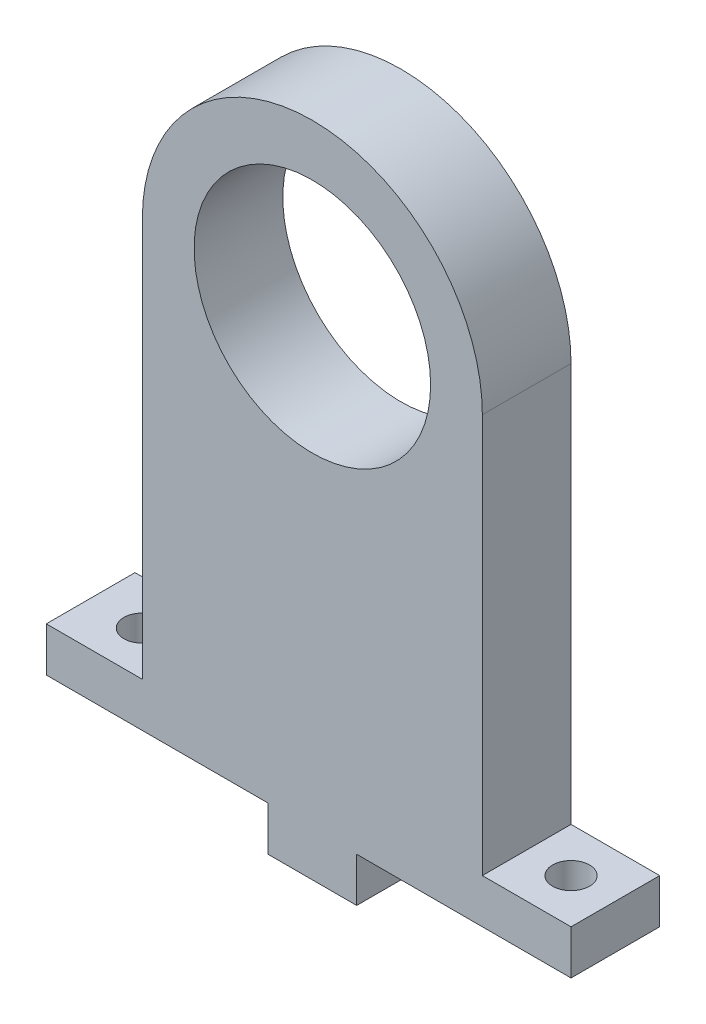
ISO-10303-21;
HEADER;
FILE_DESCRIPTION(('STEP AP214'),'2;1');
FILE_NAME('part.step','',(''),(''),'','','');
FILE_SCHEMA(('AUTOMOTIVE_DESIGN { 1 0 10303 214 1 1 1 1 }'));
ENDSEC;
DATA;
#1=APPLICATION_CONTEXT('core data for automotive mechanical design processes');
#2=APPLICATION_PROTOCOL_DEFINITION('international standard','automotive_design',2000,#1);
#3=PRODUCT_CONTEXT('',#1,'mechanical');
#4=PRODUCT('Part','Part','',(#3));
#5=PRODUCT_RELATED_PRODUCT_CATEGORY('part','',(#4));
#6=PRODUCT_DEFINITION_FORMATION('','',#4);
#7=PRODUCT_DEFINITION_CONTEXT('part definition',#1,'design');
#8=PRODUCT_DEFINITION('design','',#6,#7);
#9=PRODUCT_DEFINITION_SHAPE('','',#8);
#10=(LENGTH_UNIT() NAMED_UNIT(*) SI_UNIT(.MILLI.,.METRE.));
#11=(NAMED_UNIT(*) PLANE_ANGLE_UNIT() SI_UNIT($,.RADIAN.));
#12=(NAMED_UNIT(*) SI_UNIT($,.STERADIAN.) SOLID_ANGLE_UNIT());
#13=UNCERTAINTY_MEASURE_WITH_UNIT(LENGTH_MEASURE(1.E-05),#10,'distance_accuracy_value','');
#14=(GEOMETRIC_REPRESENTATION_CONTEXT(3) GLOBAL_UNCERTAINTY_ASSIGNED_CONTEXT((#13)) GLOBAL_UNIT_ASSIGNED_CONTEXT((#10,
#11,#12)) REPRESENTATION_CONTEXT('',''));
#15=CARTESIAN_POINT('',(0.,0.,0.));
#16=DIRECTION('',(0.,0.,1.));
#17=DIRECTION('',(1.,0.,0.));
#18=AXIS2_PLACEMENT_3D('',#15,#16,#17);
#19=CARTESIAN_POINT('',(0.,0.,6.));
#20=DIRECTION('',(0.,0.,1.));
#21=DIRECTION('',(1.,0.,0.));
#22=AXIS2_PLACEMENT_3D('',#19,#20,#21);
#23=PLANE('',#22);
#24=DIRECTION('',(1.,0.,0.));
#25=VECTOR('',#24,1.);
#26=CARTESIAN_POINT('',(0.,-33.,6.));
#27=LINE('',#26,#25);
#28=CARTESIAN_POINT('',(-2.99999999999998,-33.,6.));
#29=VERTEX_POINT('',#28);
#30=CARTESIAN_POINT('',(3.00000000000002,-33.,6.));
#31=VERTEX_POINT('',#30);
#32=EDGE_CURVE('E52',#29,#31,#27,.T.);
#33=ORIENTED_EDGE('',*,*,#32,.T.);
#34=DIRECTION('',(0.,1.,0.));
#35=VECTOR('',#34,1.);
#36=CARTESIAN_POINT('',(3.00000000000002,-33.,6.));
#37=LINE('',#36,#35);
#38=CARTESIAN_POINT('',(3.00000000000002,-30.,6.));
#39=VERTEX_POINT('',#38);
#40=EDGE_CURVE('E108',#31,#39,#37,.T.);
#41=ORIENTED_EDGE('',*,*,#40,.T.);
#42=DIRECTION('',(1.,0.,0.));
#43=VECTOR('',#42,1.);
#44=CARTESIAN_POINT('',(17.5,-30.,6.));
#45=LINE('',#44,#43);
#46=CARTESIAN_POINT('',(17.5,-30.,6.));
#47=VERTEX_POINT('',#46);
#48=EDGE_CURVE('E208',#39,#47,#45,.T.);
#49=ORIENTED_EDGE('',*,*,#48,.T.);
#50=DIRECTION('',(0.,1.,0.));
#51=VECTOR('',#50,1.);
#52=CARTESIAN_POINT('',(17.5,-27.,6.));
#53=LINE('',#52,#51);
#54=CARTESIAN_POINT('',(17.5,-27.,6.));
#55=VERTEX_POINT('',#54);
#56=EDGE_CURVE('E228',#47,#55,#53,.T.);
#57=ORIENTED_EDGE('',*,*,#56,.T.);
#58=DIRECTION('',(-1.,0.,0.));
#59=VECTOR('',#58,1.);
#60=CARTESIAN_POINT('',(11.5,-27.,6.));
#61=LINE('',#60,#59);
#62=CARTESIAN_POINT('',(11.5,-27.,6.));
#63=VERTEX_POINT('',#62);
#64=EDGE_CURVE('E225',#55,#63,#61,.T.);
#65=ORIENTED_EDGE('',*,*,#64,.T.);
#66=DIRECTION('',(0.,1.,0.));
#67=VECTOR('',#66,1.);
#68=CARTESIAN_POINT('',(11.5,0.,6.));
#69=LINE('',#68,#67);
#70=CARTESIAN_POINT('',(11.5,0.,6.));
#71=VERTEX_POINT('',#70);
#72=EDGE_CURVE('E227',#63,#71,#69,.T.);
#73=ORIENTED_EDGE('',*,*,#72,.T.);
#74=CARTESIAN_POINT('',(0.,0.,6.));
#75=DIRECTION('',(0.,0.,1.));
#76=DIRECTION('',(1.,0.,0.));
#77=AXIS2_PLACEMENT_3D('',#74,#75,#76);
#78=CIRCLE('',#77,11.5);
#79=CARTESIAN_POINT('',(-11.5,0.,6.));
#80=VERTEX_POINT('',#79);
#81=EDGE_CURVE('E230',#71,#80,#78,.T.);
#82=ORIENTED_EDGE('',*,*,#81,.T.);
#83=DIRECTION('',(0.,-1.,0.));
#84=VECTOR('',#83,1.);
#85=CARTESIAN_POINT('',(-11.5,0.,6.));
#86=LINE('',#85,#84);
#87=CARTESIAN_POINT('',(-11.5,-27.,6.));
#88=VERTEX_POINT('',#87);
#89=EDGE_CURVE('E236',#80,#88,#86,.T.);
#90=ORIENTED_EDGE('',*,*,#89,.T.);
#91=DIRECTION('',(-1.,0.,0.));
#92=VECTOR('',#91,1.);
#93=CARTESIAN_POINT('',(-11.5,-27.,6.));
#94=LINE('',#93,#92);
#95=CARTESIAN_POINT('',(-18.,-27.,6.));
#96=VERTEX_POINT('',#95);
#97=EDGE_CURVE('E140',#88,#96,#94,.T.);
#98=ORIENTED_EDGE('',*,*,#97,.T.);
#99=DIRECTION('',(0.,-1.,0.));
#100=VECTOR('',#99,1.);
#101=CARTESIAN_POINT('',(-18.,-27.,6.));
#102=LINE('',#101,#100);
#103=CARTESIAN_POINT('',(-18.,-30.,6.));
#104=VERTEX_POINT('',#103);
#105=EDGE_CURVE('E134',#96,#104,#102,.T.);
#106=ORIENTED_EDGE('',*,*,#105,.T.);
#107=DIRECTION('',(1.,0.,0.));
#108=VECTOR('',#107,1.);
#109=CARTESIAN_POINT('',(-2.99999999999998,-30.,6.));
#110=LINE('',#109,#108);
#111=CARTESIAN_POINT('',(-2.99999999999998,-30.,6.));
#112=VERTEX_POINT('',#111);
#113=EDGE_CURVE('E138',#104,#112,#110,.T.);
#114=ORIENTED_EDGE('',*,*,#113,.T.);
#115=DIRECTION('',(0.,-1.,0.));
#116=VECTOR('',#115,1.);
#117=CARTESIAN_POINT('',(-2.99999999999998,-33.,6.));
#118=LINE('',#117,#116);
#119=EDGE_CURVE('E154',#112,#29,#118,.T.);
#120=ORIENTED_EDGE('',*,*,#119,.T.);
#121=EDGE_LOOP('',(#33,#41,#49,#57,#65,#73,#82,#90,#98,#106,#114,#120));
#122=FACE_BOUND('',#121,.T.);
#123=CARTESIAN_POINT('',(0.,0.,6.));
#124=DIRECTION('',(0.,0.,1.));
#125=DIRECTION('',(1.,0.,0.));
#126=AXIS2_PLACEMENT_3D('',#123,#124,#125);
#127=CIRCLE('',#126,8.);
#128=CARTESIAN_POINT('',(8.,0.,6.));
#129=VERTEX_POINT('',#128);
#130=EDGE_CURVE('E163',#129,#129,#127,.T.);
#131=ORIENTED_EDGE('',*,*,#130,.F.);
#132=EDGE_LOOP('',(#131));
#133=FACE_BOUND('',#132,.T.);
#134=ADVANCED_FACE('F35',(#122,#133),#23,.T.);
#135=CARTESIAN_POINT('',(0.,0.,0.));
#136=DIRECTION('',(0.,0.,1.));
#137=DIRECTION('',(1.,0.,0.));
#138=AXIS2_PLACEMENT_3D('',#135,#136,#137);
#139=PLANE('',#138);
#140=DIRECTION('',(0.,1.,0.));
#141=VECTOR('',#140,1.);
#142=CARTESIAN_POINT('',(3.00000000000002,-33.,0.));
#143=LINE('',#142,#141);
#144=CARTESIAN_POINT('',(3.00000000000002,-33.,0.));
#145=VERTEX_POINT('',#144);
#146=CARTESIAN_POINT('',(3.00000000000002,-30.,0.));
#147=VERTEX_POINT('',#146);
#148=EDGE_CURVE('E160',#145,#147,#143,.T.);
#149=ORIENTED_EDGE('',*,*,#148,.F.);
#150=DIRECTION('',(1.,0.,0.));
#151=VECTOR('',#150,1.);
#152=CARTESIAN_POINT('',(0.,-33.,0.));
#153=LINE('',#152,#151);
#154=CARTESIAN_POINT('',(-2.99999999999998,-33.,0.));
#155=VERTEX_POINT('',#154);
#156=EDGE_CURVE('E180',#155,#145,#153,.T.);
#157=ORIENTED_EDGE('',*,*,#156,.F.);
#158=DIRECTION('',(0.,-1.,0.));
#159=VECTOR('',#158,1.);
#160=CARTESIAN_POINT('',(-2.99999999999998,-33.,0.));
#161=LINE('',#160,#159);
#162=CARTESIAN_POINT('',(-2.99999999999998,-30.,0.));
#163=VERTEX_POINT('',#162);
#164=EDGE_CURVE('E101',#163,#155,#161,.T.);
#165=ORIENTED_EDGE('',*,*,#164,.F.);
#166=DIRECTION('',(1.,0.,0.));
#167=VECTOR('',#166,1.);
#168=CARTESIAN_POINT('',(-2.99999999999998,-30.,0.));
#169=LINE('',#168,#167);
#170=CARTESIAN_POINT('',(-18.,-30.,0.));
#171=VERTEX_POINT('',#170);
#172=EDGE_CURVE('E94',#171,#163,#169,.T.);
#173=ORIENTED_EDGE('',*,*,#172,.F.);
#174=DIRECTION('',(0.,-1.,0.));
#175=VECTOR('',#174,1.);
#176=CARTESIAN_POINT('',(-18.,-27.,0.));
#177=LINE('',#176,#175);
#178=CARTESIAN_POINT('',(-18.,-27.,0.));
#179=VERTEX_POINT('',#178);
#180=EDGE_CURVE('E148',#179,#171,#177,.T.);
#181=ORIENTED_EDGE('',*,*,#180,.F.);
#182=DIRECTION('',(-1.,0.,0.));
#183=VECTOR('',#182,1.);
#184=CARTESIAN_POINT('',(-11.5,-27.,0.));
#185=LINE('',#184,#183);
#186=CARTESIAN_POINT('',(-11.5,-27.,0.));
#187=VERTEX_POINT('',#186);
#188=EDGE_CURVE('E175',#187,#179,#185,.T.);
#189=ORIENTED_EDGE('',*,*,#188,.F.);
#190=DIRECTION('',(0.,-1.,0.));
#191=VECTOR('',#190,1.);
#192=CARTESIAN_POINT('',(-11.5,0.,0.));
#193=LINE('',#192,#191);
#194=CARTESIAN_POINT('',(-11.5,0.,0.));
#195=VERTEX_POINT('',#194);
#196=EDGE_CURVE('E173',#195,#187,#193,.T.);
#197=ORIENTED_EDGE('',*,*,#196,.F.);
#198=CARTESIAN_POINT('',(0.,0.,0.));
#199=DIRECTION('',(0.,0.,1.));
#200=DIRECTION('',(1.,0.,0.));
#201=AXIS2_PLACEMENT_3D('',#198,#199,#200);
#202=CIRCLE('',#201,11.5);
#203=CARTESIAN_POINT('',(11.5,0.,0.));
#204=VERTEX_POINT('',#203);
#205=EDGE_CURVE('E171',#204,#195,#202,.T.);
#206=ORIENTED_EDGE('',*,*,#205,.F.);
#207=DIRECTION('',(0.,1.,0.));
#208=VECTOR('',#207,1.);
#209=CARTESIAN_POINT('',(11.5,0.,0.));
#210=LINE('',#209,#208);
#211=CARTESIAN_POINT('',(11.5,-27.,0.));
#212=VERTEX_POINT('',#211);
#213=EDGE_CURVE('E169',#212,#204,#210,.T.);
#214=ORIENTED_EDGE('',*,*,#213,.F.);
#215=DIRECTION('',(-1.,0.,0.));
#216=VECTOR('',#215,1.);
#217=CARTESIAN_POINT('',(11.5,-27.,0.));
#218=LINE('',#217,#216);
#219=CARTESIAN_POINT('',(17.5,-27.,0.));
#220=VERTEX_POINT('',#219);
#221=EDGE_CURVE('E167',#220,#212,#218,.T.);
#222=ORIENTED_EDGE('',*,*,#221,.F.);
#223=DIRECTION('',(0.,1.,0.));
#224=VECTOR('',#223,1.);
#225=CARTESIAN_POINT('',(17.5,-27.,0.));
#226=LINE('',#225,#224);
#227=CARTESIAN_POINT('',(17.5,-30.,0.));
#228=VERTEX_POINT('',#227);
#229=EDGE_CURVE('E165',#228,#220,#226,.T.);
#230=ORIENTED_EDGE('',*,*,#229,.F.);
#231=DIRECTION('',(1.,0.,0.));
#232=VECTOR('',#231,1.);
#233=CARTESIAN_POINT('',(17.5,-30.,0.));
#234=LINE('',#233,#232);
#235=EDGE_CURVE('E162',#147,#228,#234,.T.);
#236=ORIENTED_EDGE('',*,*,#235,.F.);
#237=EDGE_LOOP('',(#149,#157,#165,#173,#181,#189,#197,#206,#214,#222,#230,#236));
#238=FACE_BOUND('',#237,.T.);
#239=CARTESIAN_POINT('',(0.,0.,0.));
#240=DIRECTION('',(0.,0.,1.));
#241=DIRECTION('',(1.,0.,0.));
#242=AXIS2_PLACEMENT_3D('',#239,#240,#241);
#243=CIRCLE('',#242,8.);
#244=CARTESIAN_POINT('',(8.,0.,0.));
#245=VERTEX_POINT('',#244);
#246=EDGE_CURVE('E252',#245,#245,#243,.T.);
#247=ORIENTED_EDGE('',*,*,#246,.T.);
#248=EDGE_LOOP('',(#247));
#249=FACE_BOUND('',#248,.T.);
#250=ADVANCED_FACE('F212',(#238,#249),#139,.F.);
#251=CARTESIAN_POINT('',(3.00000000000002,-33.,6.));
#252=DIRECTION('',(-1.,0.,0.));
#253=DIRECTION('',(0.,-1.,0.));
#254=AXIS2_PLACEMENT_3D('',#251,#252,#253);
#255=PLANE('',#254);
#256=ORIENTED_EDGE('',*,*,#148,.T.);
#257=DIRECTION('',(0.,0.,-1.));
#258=VECTOR('',#257,1.);
#259=CARTESIAN_POINT('',(3.00000000000002,-30.,6.));
#260=LINE('',#259,#258);
#261=EDGE_CURVE('E44',#39,#147,#260,.T.);
#262=ORIENTED_EDGE('',*,*,#261,.F.);
#263=ORIENTED_EDGE('',*,*,#40,.F.);
#264=DIRECTION('',(0.,0.,-1.));
#265=VECTOR('',#264,1.);
#266=CARTESIAN_POINT('',(3.00000000000002,-33.,6.));
#267=LINE('',#266,#265);
#268=EDGE_CURVE('E11',#31,#145,#267,.T.);
#269=ORIENTED_EDGE('',*,*,#268,.T.);
#270=EDGE_LOOP('',(#256,#262,#263,#269));
#271=FACE_BOUND('',#270,.T.);
#272=ADVANCED_FACE('F37',(#271),#255,.F.);
#273=CARTESIAN_POINT('',(17.5,-30.,6.));
#274=DIRECTION('',(0.,1.,0.));
#275=DIRECTION('',(-1.,0.,0.));
#276=AXIS2_PLACEMENT_3D('',#273,#274,#275);
#277=PLANE('',#276);
#278=CARTESIAN_POINT('',(14.5,-30.,3.));
#279=DIRECTION('',(0.,1.,0.));
#280=DIRECTION('',(0.,0.,1.));
#281=AXIS2_PLACEMENT_3D('',#278,#279,#280);
#282=CIRCLE('',#281,1.25);
#283=CARTESIAN_POINT('',(14.5,-30.,4.25));
#284=VERTEX_POINT('',#283);
#285=EDGE_CURVE('E261',#284,#284,#282,.T.);
#286=ORIENTED_EDGE('',*,*,#285,.T.);
#287=EDGE_LOOP('',(#286));
#288=FACE_BOUND('',#287,.T.);
#289=ORIENTED_EDGE('',*,*,#235,.T.);
#290=DIRECTION('',(0.,0.,-1.));
#291=VECTOR('',#290,1.);
#292=CARTESIAN_POINT('',(17.5,-30.,6.));
#293=LINE('',#292,#291);
#294=EDGE_CURVE('E200',#47,#228,#293,.T.);
#295=ORIENTED_EDGE('',*,*,#294,.F.);
#296=ORIENTED_EDGE('',*,*,#48,.F.);
#297=ORIENTED_EDGE('',*,*,#261,.T.);
#298=EDGE_LOOP('',(#289,#295,#296,#297));
#299=FACE_BOUND('',#298,.T.);
#300=ADVANCED_FACE('F206',(#288,#299),#277,.F.);
#301=CARTESIAN_POINT('',(17.5,-27.,6.));
#302=DIRECTION('',(-1.,0.,0.));
#303=DIRECTION('',(0.,0.,1.));
#304=AXIS2_PLACEMENT_3D('',#301,#302,#303);
#305=PLANE('',#304);
#306=ORIENTED_EDGE('',*,*,#229,.T.);
#307=DIRECTION('',(0.,0.,-1.));
#308=VECTOR('',#307,1.);
#309=CARTESIAN_POINT('',(17.5,-27.,6.));
#310=LINE('',#309,#308);
#311=EDGE_CURVE('E197',#55,#220,#310,.T.);
#312=ORIENTED_EDGE('',*,*,#311,.F.);
#313=ORIENTED_EDGE('',*,*,#56,.F.);
#314=ORIENTED_EDGE('',*,*,#294,.T.);
#315=EDGE_LOOP('',(#306,#312,#313,#314));
#316=FACE_BOUND('',#315,.T.);
#317=ADVANCED_FACE('F219',(#316),#305,.F.);
#318=CARTESIAN_POINT('',(11.5,-27.,6.));
#319=DIRECTION('',(0.,-1.,0.));
#320=DIRECTION('',(0.,0.,-1.));
#321=AXIS2_PLACEMENT_3D('',#318,#319,#320);
#322=PLANE('',#321);
#323=CARTESIAN_POINT('',(14.5,-27.,3.));
#324=DIRECTION('',(0.,1.,0.));
#325=DIRECTION('',(0.,0.,1.));
#326=AXIS2_PLACEMENT_3D('',#323,#324,#325);
#327=CIRCLE('',#326,1.25);
#328=CARTESIAN_POINT('',(14.5,-27.,4.25));
#329=VERTEX_POINT('',#328);
#330=EDGE_CURVE('E264',#329,#329,#327,.T.);
#331=ORIENTED_EDGE('',*,*,#330,.F.);
#332=EDGE_LOOP('',(#331));
#333=FACE_BOUND('',#332,.T.);
#334=ORIENTED_EDGE('',*,*,#221,.T.);
#335=DIRECTION('',(0.,0.,-1.));
#336=VECTOR('',#335,1.);
#337=CARTESIAN_POINT('',(11.5,-27.,6.));
#338=LINE('',#337,#336);
#339=EDGE_CURVE('E194',#63,#212,#338,.T.);
#340=ORIENTED_EDGE('',*,*,#339,.F.);
#341=ORIENTED_EDGE('',*,*,#64,.F.);
#342=ORIENTED_EDGE('',*,*,#311,.T.);
#343=EDGE_LOOP('',(#334,#340,#341,#342));
#344=FACE_BOUND('',#343,.T.);
#345=ADVANCED_FACE('F223',(#333,#344),#322,.F.);
#346=CARTESIAN_POINT('',(11.5,0.,6.));
#347=DIRECTION('',(-1.,0.,0.));
#348=DIRECTION('',(0.,-1.,0.));
#349=AXIS2_PLACEMENT_3D('',#346,#347,#348);
#350=PLANE('',#349);
#351=ORIENTED_EDGE('',*,*,#213,.T.);
#352=DIRECTION('',(0.,0.,-1.));
#353=VECTOR('',#352,1.);
#354=CARTESIAN_POINT('',(11.5,0.,6.));
#355=LINE('',#354,#353);
#356=EDGE_CURVE('E191',#71,#204,#355,.T.);
#357=ORIENTED_EDGE('',*,*,#356,.F.);
#358=ORIENTED_EDGE('',*,*,#72,.F.);
#359=ORIENTED_EDGE('',*,*,#339,.T.);
#360=EDGE_LOOP('',(#351,#357,#358,#359));
#361=FACE_BOUND('',#360,.T.);
#362=ADVANCED_FACE('F279',(#361),#350,.F.);
#363=CARTESIAN_POINT('',(0.,0.,6.));
#364=DIRECTION('',(0.,0.,-1.));
#365=DIRECTION('',(-1.,0.,0.));
#366=AXIS2_PLACEMENT_3D('',#363,#364,#365);
#367=CYLINDRICAL_SURFACE('',#366,11.5);
#368=ORIENTED_EDGE('',*,*,#205,.T.);
#369=DIRECTION('',(0.,0.,-1.));
#370=VECTOR('',#369,1.);
#371=CARTESIAN_POINT('',(-11.5,0.,6.));
#372=LINE('',#371,#370);
#373=EDGE_CURVE('E188',#80,#195,#372,.T.);
#374=ORIENTED_EDGE('',*,*,#373,.F.);
#375=ORIENTED_EDGE('',*,*,#81,.F.);
#376=ORIENTED_EDGE('',*,*,#356,.T.);
#377=EDGE_LOOP('',(#368,#374,#375,#376));
#378=FACE_BOUND('',#377,.T.);
#379=ADVANCED_FACE('F285',(#378),#367,.T.);
#380=CARTESIAN_POINT('',(-11.5,0.,6.));
#381=DIRECTION('',(1.,0.,0.));
#382=DIRECTION('',(0.,1.,0.));
#383=AXIS2_PLACEMENT_3D('',#380,#381,#382);
#384=PLANE('',#383);
#385=ORIENTED_EDGE('',*,*,#196,.T.);
#386=DIRECTION('',(0.,0.,-1.));
#387=VECTOR('',#386,1.);
#388=CARTESIAN_POINT('',(-11.5,-27.,6.));
#389=LINE('',#388,#387);
#390=EDGE_CURVE('E185',#88,#187,#389,.T.);
#391=ORIENTED_EDGE('',*,*,#390,.F.);
#392=ORIENTED_EDGE('',*,*,#89,.F.);
#393=ORIENTED_EDGE('',*,*,#373,.T.);
#394=EDGE_LOOP('',(#385,#391,#392,#393));
#395=FACE_BOUND('',#394,.T.);
#396=ADVANCED_FACE('F242',(#395),#384,.F.);
#397=CARTESIAN_POINT('',(-11.5,-27.,6.));
#398=DIRECTION('',(0.,-1.,0.));
#399=DIRECTION('',(1.,0.,0.));
#400=AXIS2_PLACEMENT_3D('',#397,#398,#399);
#401=PLANE('',#400);
#402=CARTESIAN_POINT('',(-14.5,-27.,3.));
#403=DIRECTION('',(0.,1.,0.));
#404=DIRECTION('',(0.,0.,1.));
#405=AXIS2_PLACEMENT_3D('',#402,#403,#404);
#406=CIRCLE('',#405,1.25);
#407=CARTESIAN_POINT('',(-14.5,-27.,4.25));
#408=VERTEX_POINT('',#407);
#409=EDGE_CURVE('E258',#408,#408,#406,.T.);
#410=ORIENTED_EDGE('',*,*,#409,.F.);
#411=EDGE_LOOP('',(#410));
#412=FACE_BOUND('',#411,.T.);
#413=ORIENTED_EDGE('',*,*,#188,.T.);
#414=DIRECTION('',(0.,0.,-1.));
#415=VECTOR('',#414,1.);
#416=CARTESIAN_POINT('',(-18.,-27.,6.));
#417=LINE('',#416,#415);
#418=EDGE_CURVE('E149',#96,#179,#417,.T.);
#419=ORIENTED_EDGE('',*,*,#418,.F.);
#420=ORIENTED_EDGE('',*,*,#97,.F.);
#421=ORIENTED_EDGE('',*,*,#390,.T.);
#422=EDGE_LOOP('',(#413,#419,#420,#421));
#423=FACE_BOUND('',#422,.T.);
#424=ADVANCED_FACE('F246',(#412,#423),#401,.F.);
#425=CARTESIAN_POINT('',(-18.,-27.,6.));
#426=DIRECTION('',(1.,0.,0.));
#427=DIRECTION('',(0.,1.,0.));
#428=AXIS2_PLACEMENT_3D('',#425,#426,#427);
#429=PLANE('',#428);
#430=ORIENTED_EDGE('',*,*,#180,.T.);
#431=DIRECTION('',(0.,0.,-1.));
#432=VECTOR('',#431,1.);
#433=CARTESIAN_POINT('',(-18.,-30.,6.));
#434=LINE('',#433,#432);
#435=EDGE_CURVE('E145',#104,#171,#434,.T.);
#436=ORIENTED_EDGE('',*,*,#435,.F.);
#437=ORIENTED_EDGE('',*,*,#105,.F.);
#438=ORIENTED_EDGE('',*,*,#418,.T.);
#439=EDGE_LOOP('',(#430,#436,#437,#438));
#440=FACE_BOUND('',#439,.T.);
#441=ADVANCED_FACE('F146',(#440),#429,.F.);
#442=CARTESIAN_POINT('',(-2.99999999999998,-30.,6.));
#443=DIRECTION('',(0.,1.,0.));
#444=DIRECTION('',(0.,0.,1.));
#445=AXIS2_PLACEMENT_3D('',#442,#443,#444);
#446=PLANE('',#445);
#447=CARTESIAN_POINT('',(-14.5,-30.,3.));
#448=DIRECTION('',(0.,1.,0.));
#449=DIRECTION('',(0.,0.,1.));
#450=AXIS2_PLACEMENT_3D('',#447,#448,#449);
#451=CIRCLE('',#450,1.25);
#452=CARTESIAN_POINT('',(-14.5,-30.,4.25));
#453=VERTEX_POINT('',#452);
#454=EDGE_CURVE('E255',#453,#453,#451,.T.);
#455=ORIENTED_EDGE('',*,*,#454,.T.);
#456=EDGE_LOOP('',(#455));
#457=FACE_BOUND('',#456,.T.);
#458=ORIENTED_EDGE('',*,*,#172,.T.);
#459=DIRECTION('',(0.,0.,-1.));
#460=VECTOR('',#459,1.);
#461=CARTESIAN_POINT('',(-2.99999999999998,-30.,6.));
#462=LINE('',#461,#460);
#463=EDGE_CURVE('E150',#112,#163,#462,.T.);
#464=ORIENTED_EDGE('',*,*,#463,.F.);
#465=ORIENTED_EDGE('',*,*,#113,.F.);
#466=ORIENTED_EDGE('',*,*,#435,.T.);
#467=EDGE_LOOP('',(#458,#464,#465,#466));
#468=FACE_BOUND('',#467,.T.);
#469=ADVANCED_FACE('F152',(#457,#468),#446,.F.);
#470=CARTESIAN_POINT('',(-2.99999999999998,-33.,6.));
#471=DIRECTION('',(1.,0.,0.));
#472=DIRECTION('',(0.,0.,-1.));
#473=AXIS2_PLACEMENT_3D('',#470,#471,#472);
#474=PLANE('',#473);
#475=ORIENTED_EDGE('',*,*,#164,.T.);
#476=DIRECTION('',(0.,0.,-1.));
#477=VECTOR('',#476,1.);
#478=CARTESIAN_POINT('',(-2.99999999999998,-33.,6.));
#479=LINE('',#478,#477);
#480=EDGE_CURVE('E156',#29,#155,#479,.T.);
#481=ORIENTED_EDGE('',*,*,#480,.F.);
#482=ORIENTED_EDGE('',*,*,#119,.F.);
#483=ORIENTED_EDGE('',*,*,#463,.T.);
#484=EDGE_LOOP('',(#475,#481,#482,#483));
#485=FACE_BOUND('',#484,.T.);
#486=ADVANCED_FACE('F248',(#485),#474,.F.);
#487=CARTESIAN_POINT('',(0.,-33.,6.));
#488=DIRECTION('',(0.,1.,0.));
#489=DIRECTION('',(0.,0.,1.));
#490=AXIS2_PLACEMENT_3D('',#487,#488,#489);
#491=PLANE('',#490);
#492=ORIENTED_EDGE('',*,*,#156,.T.);
#493=ORIENTED_EDGE('',*,*,#268,.F.);
#494=ORIENTED_EDGE('',*,*,#32,.F.);
#495=ORIENTED_EDGE('',*,*,#480,.T.);
#496=EDGE_LOOP('',(#492,#493,#494,#495));
#497=FACE_BOUND('',#496,.T.);
#498=ADVANCED_FACE('F247',(#497),#491,.F.);
#499=CARTESIAN_POINT('',(0.,0.,6.));
#500=DIRECTION('',(0.,0.,-1.));
#501=DIRECTION('',(-1.,0.,0.));
#502=AXIS2_PLACEMENT_3D('',#499,#500,#501);
#503=CYLINDRICAL_SURFACE('',#502,8.);
#504=ORIENTED_EDGE('',*,*,#130,.T.);
#505=EDGE_LOOP('',(#504));
#506=FACE_BOUND('',#505,.T.);
#507=ORIENTED_EDGE('',*,*,#246,.F.);
#508=EDGE_LOOP('',(#507));
#509=FACE_BOUND('',#508,.T.);
#510=ADVANCED_FACE('F296',(#506,#509),#503,.F.);
#511=CARTESIAN_POINT('',(-14.5,-30.,3.));
#512=DIRECTION('',(0.,1.,0.));
#513=DIRECTION('',(0.,0.,1.));
#514=AXIS2_PLACEMENT_3D('',#511,#512,#513);
#515=CYLINDRICAL_SURFACE('',#514,1.25);
#516=ORIENTED_EDGE('',*,*,#454,.F.);
#517=EDGE_LOOP('',(#516));
#518=FACE_BOUND('',#517,.T.);
#519=ORIENTED_EDGE('',*,*,#409,.T.);
#520=EDGE_LOOP('',(#519));
#521=FACE_BOUND('',#520,.T.);
#522=ADVANCED_FACE('F274',(#518,#521),#515,.F.);
#523=CARTESIAN_POINT('',(14.5,-30.,3.));
#524=DIRECTION('',(0.,1.,0.));
#525=DIRECTION('',(0.,0.,1.));
#526=AXIS2_PLACEMENT_3D('',#523,#524,#525);
#527=CYLINDRICAL_SURFACE('',#526,1.25);
#528=ORIENTED_EDGE('',*,*,#285,.F.);
#529=EDGE_LOOP('',(#528));
#530=FACE_BOUND('',#529,.T.);
#531=ORIENTED_EDGE('',*,*,#330,.T.);
#532=EDGE_LOOP('',(#531));
#533=FACE_BOUND('',#532,.T.);
#534=ADVANCED_FACE('F271',(#530,#533),#527,.F.);
#535=CLOSED_SHELL('',(#134,#250,#272,#300,#317,#345,#362,#379,#396,#424,#441,#469,#486,#498,
#510,#522,#534));
#536=MANIFOLD_SOLID_BREP('B2',#535);
#537=ADVANCED_BREP_SHAPE_REPRESENTATION('',(#18,#536),#14);
#538=SHAPE_DEFINITION_REPRESENTATION(#9,#537);
ENDSEC;
END-ISO-10303-21;
